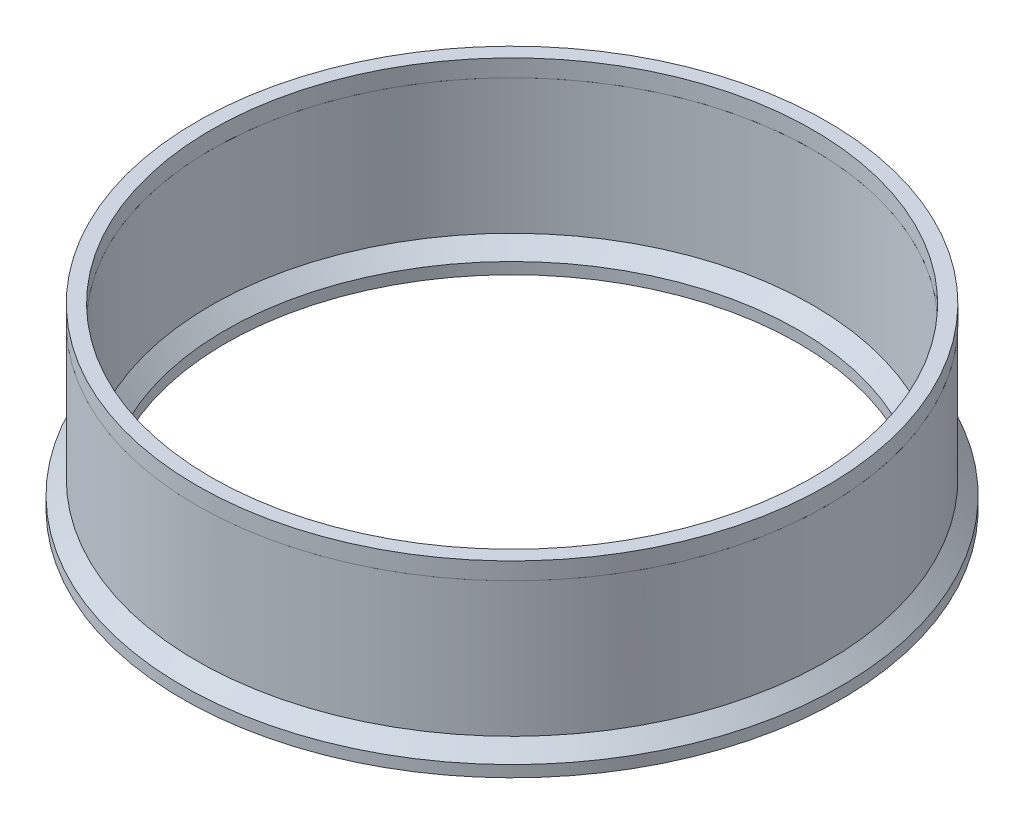
ISO-10303-21;
HEADER;
FILE_DESCRIPTION(('STEP AP214'),'2;1');
FILE_NAME('part.step','',(''),(''),'','','');
FILE_SCHEMA(('AUTOMOTIVE_DESIGN { 1 0 10303 214 1 1 1 1 }'));
ENDSEC;
DATA;
#1=APPLICATION_CONTEXT('core data for automotive mechanical design processes');
#2=APPLICATION_PROTOCOL_DEFINITION('international standard','automotive_design',2000,#1);
#3=PRODUCT_CONTEXT('',#1,'mechanical');
#4=PRODUCT('Part','Part','',(#3));
#5=PRODUCT_RELATED_PRODUCT_CATEGORY('part','',(#4));
#6=PRODUCT_DEFINITION_FORMATION('','',#4);
#7=PRODUCT_DEFINITION_CONTEXT('part definition',#1,'design');
#8=PRODUCT_DEFINITION('design','',#6,#7);
#9=PRODUCT_DEFINITION_SHAPE('','',#8);
#10=(LENGTH_UNIT() NAMED_UNIT(*) SI_UNIT(.MILLI.,.METRE.));
#11=(NAMED_UNIT(*) PLANE_ANGLE_UNIT() SI_UNIT($,.RADIAN.));
#12=(NAMED_UNIT(*) SI_UNIT($,.STERADIAN.) SOLID_ANGLE_UNIT());
#13=UNCERTAINTY_MEASURE_WITH_UNIT(LENGTH_MEASURE(1.E-05),#10,'distance_accuracy_value','');
#14=(GEOMETRIC_REPRESENTATION_CONTEXT(3) GLOBAL_UNCERTAINTY_ASSIGNED_CONTEXT((#13)) GLOBAL_UNIT_ASSIGNED_CONTEXT((#10,
#11,#12)) REPRESENTATION_CONTEXT('',''));
#15=CARTESIAN_POINT('',(0.,0.,0.));
#16=DIRECTION('',(0.,0.,1.));
#17=DIRECTION('',(1.,0.,0.));
#18=AXIS2_PLACEMENT_3D('',#15,#16,#17);
#19=CARTESIAN_POINT('',(0.,17.,0.));
#20=DIRECTION('',(0.,1.,0.));
#21=DIRECTION('',(0.,0.,1.));
#22=AXIS2_PLACEMENT_3D('',#19,#20,#21);
#23=PLANE('',#22);
#24=CARTESIAN_POINT('',(0.,17.,0.));
#25=DIRECTION('',(0.,1.,0.));
#26=DIRECTION('',(0.,0.,1.));
#27=AXIS2_PLACEMENT_3D('',#24,#25,#26);
#28=CIRCLE('',#27,55.);
#29=CARTESIAN_POINT('',(0.,17.,55.));
#30=VERTEX_POINT('',#29);
#31=EDGE_CURVE('E11',#30,#30,#28,.T.);
#32=ORIENTED_EDGE('',*,*,#31,.T.);
#33=EDGE_LOOP('',(#32));
#34=FACE_BOUND('',#33,.T.);
#35=CARTESIAN_POINT('',(0.,17.,0.));
#36=DIRECTION('',(0.,1.,0.));
#37=DIRECTION('',(0.,0.,1.));
#38=AXIS2_PLACEMENT_3D('',#35,#36,#37);
#39=CIRCLE('',#38,52.5);
#40=CARTESIAN_POINT('',(0.,17.,52.5));
#41=VERTEX_POINT('',#40);
#42=EDGE_CURVE('E52',#41,#41,#39,.T.);
#43=ORIENTED_EDGE('',*,*,#42,.F.);
#44=EDGE_LOOP('',(#43));
#45=FACE_BOUND('',#44,.T.);
#46=ADVANCED_FACE('F41',(#34,#45),#23,.T.);
#47=CARTESIAN_POINT('',(0.,14.,0.));
#48=DIRECTION('',(0.,1.,0.));
#49=DIRECTION('',(0.,0.,1.));
#50=AXIS2_PLACEMENT_3D('',#47,#48,#49);
#51=PLANE('',#50);
#52=CARTESIAN_POINT('',(0.,14.,0.));
#53=DIRECTION('',(0.,1.,0.));
#54=DIRECTION('',(0.,0.,1.));
#55=AXIS2_PLACEMENT_3D('',#52,#53,#54);
#56=CIRCLE('',#55,55.);
#57=CARTESIAN_POINT('',(0.,14.,55.));
#58=VERTEX_POINT('',#57);
#59=EDGE_CURVE('E45',#58,#58,#56,.T.);
#60=ORIENTED_EDGE('',*,*,#59,.F.);
#61=EDGE_LOOP('',(#60));
#62=FACE_BOUND('',#61,.T.);
#63=CARTESIAN_POINT('',(0.,14.,0.));
#64=DIRECTION('',(0.,1.,0.));
#65=DIRECTION('',(0.,0.,1.));
#66=AXIS2_PLACEMENT_3D('',#63,#64,#65);
#67=CIRCLE('',#66,52.5);
#68=CARTESIAN_POINT('',(0.,14.,52.5));
#69=VERTEX_POINT('',#68);
#70=EDGE_CURVE('E54',#69,#69,#67,.T.);
#71=ORIENTED_EDGE('',*,*,#70,.T.);
#72=EDGE_LOOP('',(#71));
#73=FACE_BOUND('',#72,.T.);
#74=ADVANCED_FACE('F64',(#62,#73),#51,.F.);
#75=CARTESIAN_POINT('',(0.,17.,0.));
#76=DIRECTION('',(0.,-1.,0.));
#77=DIRECTION('',(0.,0.,-1.));
#78=AXIS2_PLACEMENT_3D('',#75,#76,#77);
#79=CYLINDRICAL_SURFACE('',#78,55.);
#80=ORIENTED_EDGE('',*,*,#31,.F.);
#81=EDGE_LOOP('',(#80));
#82=FACE_BOUND('',#81,.T.);
#83=ORIENTED_EDGE('',*,*,#59,.T.);
#84=EDGE_LOOP('',(#83));
#85=FACE_BOUND('',#84,.T.);
#86=ADVANCED_FACE('F43',(#82,#85),#79,.T.);
#87=CARTESIAN_POINT('',(0.,17.,0.));
#88=DIRECTION('',(0.,-1.,0.));
#89=DIRECTION('',(0.,0.,-1.));
#90=AXIS2_PLACEMENT_3D('',#87,#88,#89);
#91=CYLINDRICAL_SURFACE('',#90,52.5);
#92=ORIENTED_EDGE('',*,*,#42,.T.);
#93=EDGE_LOOP('',(#92));
#94=FACE_BOUND('',#93,.T.);
#95=ORIENTED_EDGE('',*,*,#70,.F.);
#96=EDGE_LOOP('',(#95));
#97=FACE_BOUND('',#96,.T.);
#98=ADVANCED_FACE('F60',(#94,#97),#91,.F.);
#99=CLOSED_SHELL('',(#46,#74,#86,#98));
#100=MANIFOLD_SOLID_BREP('B2',#99);
#101=CARTESIAN_POINT('',(0.,14.,0.));
#102=DIRECTION('',(0.,-1.,0.));
#103=DIRECTION('',(0.,0.,-1.));
#104=AXIS2_PLACEMENT_3D('',#101,#102,#103);
#105=CYLINDRICAL_SURFACE('',#104,55.);
#106=CARTESIAN_POINT('',(0.,-9.49999999999996,0.));
#107=DIRECTION('',(0.,-1.,0.));
#108=DIRECTION('',(0.,0.,-1.));
#109=AXIS2_PLACEMENT_3D('',#106,#107,#108);
#110=CIRCLE('',#109,55.);
#111=CARTESIAN_POINT('',(0.,-9.49999999999996,-55.));
#112=VERTEX_POINT('',#111);
#113=EDGE_CURVE('E110',#112,#112,#110,.F.);
#114=ORIENTED_EDGE('',*,*,#113,.T.);
#115=EDGE_LOOP('',(#114));
#116=FACE_BOUND('',#115,.T.);
#117=CARTESIAN_POINT('',(0.,14.,0.));
#118=DIRECTION('',(0.,1.,0.));
#119=DIRECTION('',(0.,0.,1.));
#120=AXIS2_PLACEMENT_3D('',#117,#118,#119);
#121=CIRCLE('',#120,55.);
#122=CARTESIAN_POINT('',(0.,14.,55.));
#123=VERTEX_POINT('',#122);
#124=EDGE_CURVE('E114',#123,#123,#121,.T.);
#125=ORIENTED_EDGE('',*,*,#124,.F.);
#126=EDGE_LOOP('',(#125));
#127=FACE_BOUND('',#126,.T.);
#128=ADVANCED_FACE('F102',(#116,#127),#105,.T.);
#129=CARTESIAN_POINT('',(0.,14.,0.));
#130=DIRECTION('',(0.,-1.,0.));
#131=DIRECTION('',(0.,0.,-1.));
#132=AXIS2_PLACEMENT_3D('',#129,#130,#131);
#133=CYLINDRICAL_SURFACE('',#132,52.5);
#134=CARTESIAN_POINT('',(0.,-9.49999999999998,0.));
#135=DIRECTION('',(0.,-1.,0.));
#136=DIRECTION('',(0.,0.,-1.));
#137=AXIS2_PLACEMENT_3D('',#134,#135,#136);
#138=CIRCLE('',#137,52.5);
#139=CARTESIAN_POINT('',(0.,-9.49999999999998,-52.5));
#140=VERTEX_POINT('',#139);
#141=EDGE_CURVE('E40',#140,#140,#138,.T.);
#142=ORIENTED_EDGE('',*,*,#141,.T.);
#143=EDGE_LOOP('',(#142));
#144=FACE_BOUND('',#143,.T.);
#145=CARTESIAN_POINT('',(0.,14.,0.));
#146=DIRECTION('',(0.,1.,0.));
#147=DIRECTION('',(0.,0.,1.));
#148=AXIS2_PLACEMENT_3D('',#145,#146,#147);
#149=CIRCLE('',#148,52.5);
#150=CARTESIAN_POINT('',(0.,14.,52.5));
#151=VERTEX_POINT('',#150);
#152=EDGE_CURVE('E118',#151,#151,#149,.T.);
#153=ORIENTED_EDGE('',*,*,#152,.T.);
#154=EDGE_LOOP('',(#153));
#155=FACE_BOUND('',#154,.T.);
#156=ADVANCED_FACE('F160',(#144,#155),#133,.F.);
#157=CARTESIAN_POINT('',(0.,14.,0.));
#158=DIRECTION('',(0.,1.,0.));
#159=DIRECTION('',(0.,0.,1.));
#160=AXIS2_PLACEMENT_3D('',#157,#158,#159);
#161=PLANE('',#160);
#162=ORIENTED_EDGE('',*,*,#124,.T.);
#163=EDGE_LOOP('',(#162));
#164=FACE_BOUND('',#163,.T.);
#165=ORIENTED_EDGE('',*,*,#152,.F.);
#166=EDGE_LOOP('',(#165));
#167=FACE_BOUND('',#166,.T.);
#168=ADVANCED_FACE('F142',(#164,#167),#161,.T.);
#169=CARTESIAN_POINT('',(0.,-12.,0.));
#170=DIRECTION('',(0.,-1.,0.));
#171=DIRECTION('',(0.,0.,-1.));
#172=AXIS2_PLACEMENT_3D('',#169,#170,#171);
#173=CYLINDRICAL_SURFACE('',#172,50.);
#174=CARTESIAN_POINT('',(0.,-12.,0.));
#175=DIRECTION('',(0.,-1.,0.));
#176=DIRECTION('',(0.,0.,-1.));
#177=AXIS2_PLACEMENT_3D('',#174,#175,#176);
#178=CIRCLE('',#177,50.);
#179=CARTESIAN_POINT('',(0.,-12.,-50.));
#180=VERTEX_POINT('',#179);
#181=EDGE_CURVE('E127',#180,#180,#178,.T.);
#182=ORIENTED_EDGE('',*,*,#181,.F.);
#183=EDGE_LOOP('',(#182));
#184=FACE_BOUND('',#183,.T.);
#185=CARTESIAN_POINT('',(0.,-14.,0.));
#186=DIRECTION('',(0.,-1.,0.));
#187=DIRECTION('',(0.,0.,-1.));
#188=AXIS2_PLACEMENT_3D('',#185,#186,#187);
#189=CIRCLE('',#188,50.);
#190=CARTESIAN_POINT('',(0.,-14.,-50.));
#191=VERTEX_POINT('',#190);
#192=EDGE_CURVE('E130',#191,#191,#189,.T.);
#193=ORIENTED_EDGE('',*,*,#192,.T.);
#194=EDGE_LOOP('',(#193));
#195=FACE_BOUND('',#194,.T.);
#196=ADVANCED_FACE('F138',(#184,#195),#173,.F.);
#197=CARTESIAN_POINT('',(0.,-12.,0.));
#198=DIRECTION('',(0.,-1.,0.));
#199=DIRECTION('',(0.,0.,-1.));
#200=AXIS2_PLACEMENT_3D('',#197,#198,#199);
#201=CYLINDRICAL_SURFACE('',#200,57.5);
#202=CARTESIAN_POINT('',(0.,-12.,0.));
#203=DIRECTION('',(0.,-1.,0.));
#204=DIRECTION('',(0.,0.,-1.));
#205=AXIS2_PLACEMENT_3D('',#202,#203,#204);
#206=CIRCLE('',#205,57.5);
#207=CARTESIAN_POINT('',(0.,-12.,-57.5));
#208=VERTEX_POINT('',#207);
#209=EDGE_CURVE('E123',#208,#208,#206,.T.);
#210=ORIENTED_EDGE('',*,*,#209,.T.);
#211=EDGE_LOOP('',(#210));
#212=FACE_BOUND('',#211,.T.);
#213=CARTESIAN_POINT('',(0.,-14.,0.));
#214=DIRECTION('',(0.,-1.,0.));
#215=DIRECTION('',(0.,0.,-1.));
#216=AXIS2_PLACEMENT_3D('',#213,#214,#215);
#217=CIRCLE('',#216,57.5);
#218=CARTESIAN_POINT('',(0.,-14.,-57.5));
#219=VERTEX_POINT('',#218);
#220=EDGE_CURVE('E124',#219,#219,#217,.T.);
#221=ORIENTED_EDGE('',*,*,#220,.F.);
#222=EDGE_LOOP('',(#221));
#223=FACE_BOUND('',#222,.T.);
#224=ADVANCED_FACE('F141',(#212,#223),#201,.T.);
#225=CARTESIAN_POINT('',(0.,-14.,0.));
#226=DIRECTION('',(0.,1.,0.));
#227=DIRECTION('',(0.,0.,1.));
#228=AXIS2_PLACEMENT_3D('',#225,#226,#227);
#229=PLANE('',#228);
#230=ORIENTED_EDGE('',*,*,#192,.F.);
#231=EDGE_LOOP('',(#230));
#232=FACE_BOUND('',#231,.T.);
#233=ORIENTED_EDGE('',*,*,#220,.T.);
#234=EDGE_LOOP('',(#233));
#235=FACE_BOUND('',#234,.T.);
#236=ADVANCED_FACE('F146',(#232,#235),#229,.F.);
#237=CARTESIAN_POINT('',(0.,-12.,0.));
#238=DIRECTION('',(0.,-1.,0.));
#239=DIRECTION('',(0.,0.,-1.));
#240=AXIS2_PLACEMENT_3D('',#237,#238,#239);
#241=CONICAL_SURFACE('',#240,57.5,0.785398163397443);
#242=ORIENTED_EDGE('',*,*,#113,.F.);
#243=EDGE_LOOP('',(#242));
#244=FACE_BOUND('',#243,.T.);
#245=ORIENTED_EDGE('',*,*,#209,.F.);
#246=EDGE_LOOP('',(#245));
#247=FACE_BOUND('',#246,.T.);
#248=ADVANCED_FACE('F149',(#244,#247),#241,.T.);
#249=CARTESIAN_POINT('',(0.,-9.49999999999998,0.));
#250=DIRECTION('',(0.,1.,0.));
#251=DIRECTION('',(0.,0.,1.));
#252=AXIS2_PLACEMENT_3D('',#249,#250,#251);
#253=CONICAL_SURFACE('',#252,52.5,0.785398163397453);
#254=ORIENTED_EDGE('',*,*,#181,.T.);
#255=EDGE_LOOP('',(#254));
#256=FACE_BOUND('',#255,.T.);
#257=ORIENTED_EDGE('',*,*,#141,.F.);
#258=EDGE_LOOP('',(#257));
#259=FACE_BOUND('',#258,.T.);
#260=ADVANCED_FACE('F105',(#256,#259),#253,.F.);
#261=CLOSED_SHELL('',(#128,#156,#168,#196,#224,#236,#248,#260));
#262=MANIFOLD_SOLID_BREP('B6',#261);
#263=ADVANCED_BREP_SHAPE_REPRESENTATION('',(#18,#100,#262),#14);
#264=SHAPE_DEFINITION_REPRESENTATION(#9,#263);
ENDSEC;
END-ISO-10303-21;
